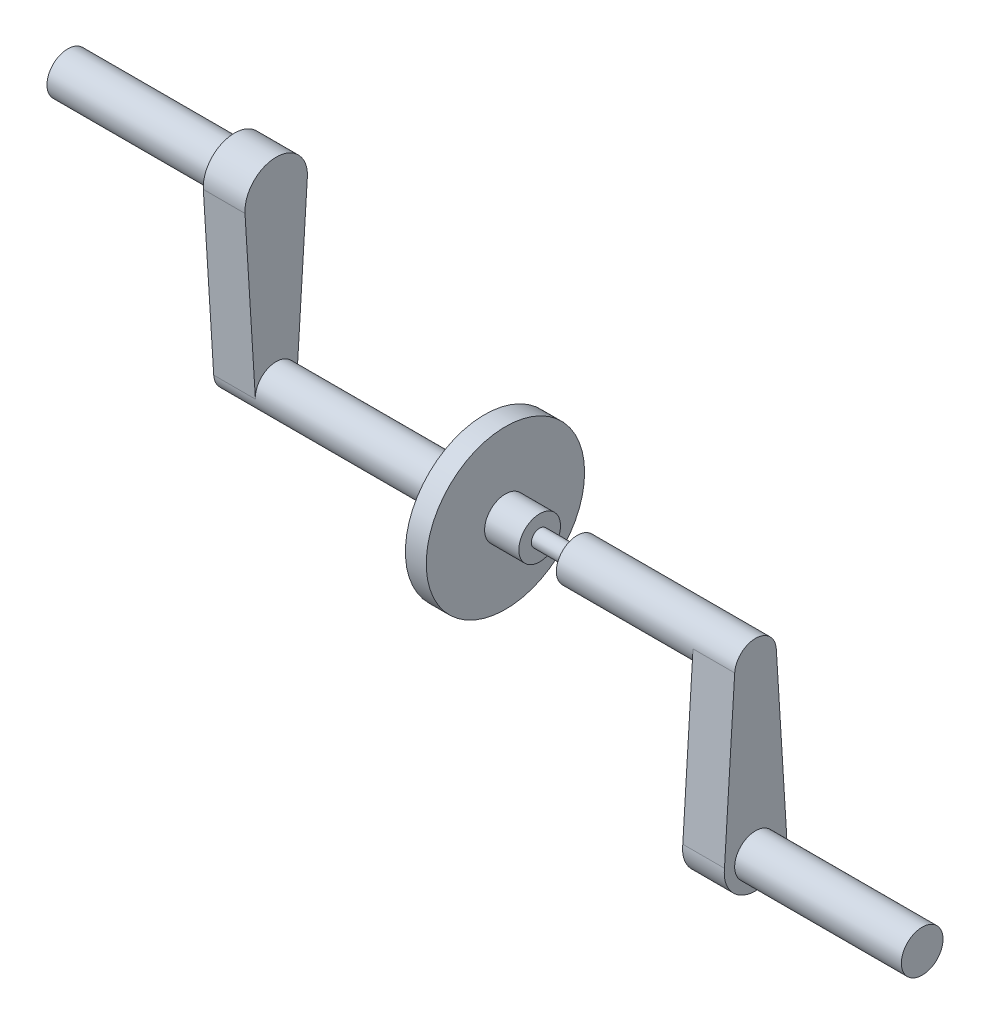
ISO-10303-21;
HEADER;
FILE_DESCRIPTION(('STEP AP214'),'2;1');
FILE_NAME('part.step','',(''),(''),'','','');
FILE_SCHEMA(('AUTOMOTIVE_DESIGN { 1 0 10303 214 1 1 1 1 }'));
ENDSEC;
DATA;
#1=APPLICATION_CONTEXT('core data for automotive mechanical design processes');
#2=APPLICATION_PROTOCOL_DEFINITION('international standard','automotive_design',2000,#1);
#3=PRODUCT_CONTEXT('',#1,'mechanical');
#4=PRODUCT('Part','Part','',(#3));
#5=PRODUCT_RELATED_PRODUCT_CATEGORY('part','',(#4));
#6=PRODUCT_DEFINITION_FORMATION('','',#4);
#7=PRODUCT_DEFINITION_CONTEXT('part definition',#1,'design');
#8=PRODUCT_DEFINITION('design','',#6,#7);
#9=PRODUCT_DEFINITION_SHAPE('','',#8);
#10=(LENGTH_UNIT() NAMED_UNIT(*) SI_UNIT(.MILLI.,.METRE.));
#11=(NAMED_UNIT(*) PLANE_ANGLE_UNIT() SI_UNIT($,.RADIAN.));
#12=(NAMED_UNIT(*) SI_UNIT($,.STERADIAN.) SOLID_ANGLE_UNIT());
#13=UNCERTAINTY_MEASURE_WITH_UNIT(LENGTH_MEASURE(1.E-05),#10,'distance_accuracy_value','');
#14=(GEOMETRIC_REPRESENTATION_CONTEXT(3) GLOBAL_UNCERTAINTY_ASSIGNED_CONTEXT((#13)) GLOBAL_UNIT_ASSIGNED_CONTEXT((#10,
#11,#12)) REPRESENTATION_CONTEXT('',''));
#15=CARTESIAN_POINT('',(0.,0.,0.));
#16=DIRECTION('',(0.,0.,1.));
#17=DIRECTION('',(1.,0.,0.));
#18=AXIS2_PLACEMENT_3D('',#15,#16,#17);
#19=CARTESIAN_POINT('',(105.,0.,0.));
#20=DIRECTION('',(-1.,0.,0.));
#21=DIRECTION('',(0.,0.,1.));
#22=AXIS2_PLACEMENT_3D('',#19,#20,#21);
#23=CYLINDRICAL_SURFACE('',#22,10.);
#24=CARTESIAN_POINT('',(5.,0.,0.));
#25=DIRECTION('',(1.,0.,0.));
#26=DIRECTION('',(0.,0.,-1.));
#27=AXIS2_PLACEMENT_3D('',#24,#25,#26);
#28=CIRCLE('',#27,10.);
#29=CARTESIAN_POINT('',(5.,0.,-10.));
#30=VERTEX_POINT('',#29);
#31=EDGE_CURVE('E11',#30,#30,#28,.T.);
#32=ORIENTED_EDGE('',*,*,#31,.T.);
#33=EDGE_LOOP('',(#32));
#34=FACE_BOUND('',#33,.T.);
#35=CARTESIAN_POINT('',(21.44,0.,0.));
#36=DIRECTION('',(1.,0.,0.));
#37=DIRECTION('',(0.,0.,-1.));
#38=AXIS2_PLACEMENT_3D('',#35,#36,#37);
#39=CIRCLE('',#38,10.);
#40=CARTESIAN_POINT('',(21.44,0.,-10.));
#41=VERTEX_POINT('',#40);
#42=EDGE_CURVE('E216',#41,#41,#39,.T.);
#43=ORIENTED_EDGE('',*,*,#42,.F.);
#44=EDGE_LOOP('',(#43));
#45=FACE_BOUND('',#44,.T.);
#46=ADVANCED_FACE('F40',(#34,#45),#23,.T.);
#47=CARTESIAN_POINT('',(5.,0.,0.));
#48=DIRECTION('',(-1.,0.,0.));
#49=DIRECTION('',(0.,0.,1.));
#50=AXIS2_PLACEMENT_3D('',#47,#48,#49);
#51=CYLINDRICAL_SURFACE('',#50,38.);
#52=CARTESIAN_POINT('',(5.,0.,0.));
#53=DIRECTION('',(1.,0.,0.));
#54=DIRECTION('',(0.,0.,-1.));
#55=AXIS2_PLACEMENT_3D('',#52,#53,#54);
#56=CIRCLE('',#55,38.);
#57=CARTESIAN_POINT('',(5.,0.,-38.));
#58=VERTEX_POINT('',#57);
#59=EDGE_CURVE('E49',#58,#58,#56,.T.);
#60=ORIENTED_EDGE('',*,*,#59,.F.);
#61=EDGE_LOOP('',(#60));
#62=FACE_BOUND('',#61,.T.);
#63=CARTESIAN_POINT('',(-5.,0.,0.));
#64=DIRECTION('',(1.,0.,0.));
#65=DIRECTION('',(0.,0.,-1.));
#66=AXIS2_PLACEMENT_3D('',#63,#64,#65);
#67=CIRCLE('',#66,38.);
#68=CARTESIAN_POINT('',(-5.,0.,-38.));
#69=VERTEX_POINT('',#68);
#70=EDGE_CURVE('E44',#69,#69,#67,.T.);
#71=ORIENTED_EDGE('',*,*,#70,.T.);
#72=EDGE_LOOP('',(#71));
#73=FACE_BOUND('',#72,.T.);
#74=ADVANCED_FACE('F42',(#62,#73),#51,.T.);
#75=CARTESIAN_POINT('',(5.,0.,0.));
#76=DIRECTION('',(1.,0.,0.));
#77=DIRECTION('',(0.,0.,-1.));
#78=AXIS2_PLACEMENT_3D('',#75,#76,#77);
#79=PLANE('',#78);
#80=ORIENTED_EDGE('',*,*,#31,.F.);
#81=EDGE_LOOP('',(#80));
#82=FACE_BOUND('',#81,.T.);
#83=ORIENTED_EDGE('',*,*,#59,.T.);
#84=EDGE_LOOP('',(#83));
#85=FACE_BOUND('',#84,.T.);
#86=ADVANCED_FACE('F180',(#82,#85),#79,.T.);
#87=CARTESIAN_POINT('',(-5.,0.,0.));
#88=DIRECTION('',(1.,0.,0.));
#89=DIRECTION('',(0.,0.,-1.));
#90=AXIS2_PLACEMENT_3D('',#87,#88,#89);
#91=PLANE('',#90);
#92=CARTESIAN_POINT('',(-5.,0.,0.));
#93=DIRECTION('',(1.,0.,0.));
#94=DIRECTION('',(0.,0.,-1.));
#95=AXIS2_PLACEMENT_3D('',#92,#93,#94);
#96=CIRCLE('',#95,10.);
#97=CARTESIAN_POINT('',(-5.,0.,-10.));
#98=VERTEX_POINT('',#97);
#99=EDGE_CURVE('E129',#98,#98,#96,.T.);
#100=ORIENTED_EDGE('',*,*,#99,.T.);
#101=EDGE_LOOP('',(#100));
#102=FACE_BOUND('',#101,.T.);
#103=ORIENTED_EDGE('',*,*,#70,.F.);
#104=EDGE_LOOP('',(#103));
#105=FACE_BOUND('',#104,.T.);
#106=ADVANCED_FACE('F178',(#102,#105),#91,.F.);
#107=CARTESIAN_POINT('',(-105.,0.,0.));
#108=DIRECTION('',(1.,0.,0.));
#109=DIRECTION('',(0.,0.,-1.));
#110=AXIS2_PLACEMENT_3D('',#107,#108,#109);
#111=CYLINDRICAL_SURFACE('',#110,10.);
#112=CARTESIAN_POINT('',(-105.,0.,0.));
#113=DIRECTION('',(1.,0.,0.));
#114=DIRECTION('',(0.,0.,-1.));
#115=AXIS2_PLACEMENT_3D('',#112,#113,#114);
#116=CIRCLE('',#115,10.);
#117=CARTESIAN_POINT('',(-105.,-0.621376726951341,-9.98067587707383));
#118=VERTEX_POINT('',#117);
#119=CARTESIAN_POINT('',(-105.,-0.624999999999999,9.98044963916957));
#120=VERTEX_POINT('',#119);
#121=EDGE_CURVE('E128',#118,#120,#116,.T.);
#122=ORIENTED_EDGE('',*,*,#121,.T.);
#123=DIRECTION('',(1.,0.,0.));
#124=VECTOR('',#123,1.);
#125=CARTESIAN_POINT('',(-125.,-0.625,9.98044963916957));
#126=LINE('',#125,#124);
#127=CARTESIAN_POINT('',(-125.,-0.625,9.98044963916957));
#128=VERTEX_POINT('',#127);
#129=EDGE_CURVE('E57',#128,#120,#126,.T.);
#130=ORIENTED_EDGE('',*,*,#129,.F.);
#131=CARTESIAN_POINT('',(-125.,0.,0.));
#132=DIRECTION('',(-1.,0.,0.));
#133=DIRECTION('',(0.,0.,1.));
#134=AXIS2_PLACEMENT_3D('',#131,#132,#133);
#135=CIRCLE('',#134,10.);
#136=CARTESIAN_POINT('',(-125.,-0.621376726951341,-9.98067587707383));
#137=VERTEX_POINT('',#136);
#138=EDGE_CURVE('E114',#137,#128,#135,.T.);
#139=ORIENTED_EDGE('',*,*,#138,.F.);
#140=DIRECTION('',(1.,0.,0.));
#141=VECTOR('',#140,1.);
#142=CARTESIAN_POINT('',(-125.,-0.621376726951341,-9.98067587707383));
#143=LINE('',#142,#141);
#144=EDGE_CURVE('E235',#137,#118,#143,.T.);
#145=ORIENTED_EDGE('',*,*,#144,.T.);
#146=EDGE_LOOP('',(#122,#130,#139,#145));
#147=FACE_BOUND('',#146,.T.);
#148=ORIENTED_EDGE('',*,*,#99,.F.);
#149=EDGE_LOOP('',(#148));
#150=FACE_BOUND('',#149,.T.);
#151=ADVANCED_FACE('F126',(#147,#150),#111,.T.);
#152=CARTESIAN_POINT('',(-125.,79.0625,14.9706744587543));
#153=DIRECTION('',(0.,0.0624999999999999,-0.998044963916957));
#154=DIRECTION('',(0.,0.998044963916957,0.0624999999999999));
#155=AXIS2_PLACEMENT_3D('',#152,#153,#154);
#156=PLANE('',#155);
#157=DIRECTION('',(0.,0.998044963916957,0.0624999999999999));
#158=VECTOR('',#157,1.);
#159=CARTESIAN_POINT('',(-105.,79.0625,14.9706744587543));
#160=LINE('',#159,#158);
#161=CARTESIAN_POINT('',(-105.,79.0625,14.9706744587544));
#162=VERTEX_POINT('',#161);
#163=EDGE_CURVE('E230',#120,#162,#160,.T.);
#164=ORIENTED_EDGE('',*,*,#163,.T.);
#165=DIRECTION('',(1.,0.,0.));
#166=VECTOR('',#165,1.);
#167=CARTESIAN_POINT('',(-125.,79.0625,14.9706744587544));
#168=LINE('',#167,#166);
#169=CARTESIAN_POINT('',(-125.,79.0625,14.9706744587544));
#170=VERTEX_POINT('',#169);
#171=EDGE_CURVE('E110',#170,#162,#168,.T.);
#172=ORIENTED_EDGE('',*,*,#171,.F.);
#173=DIRECTION('',(0.,0.998044963916957,0.0624999999999999));
#174=VECTOR('',#173,1.);
#175=CARTESIAN_POINT('',(-125.,79.0625,14.9706744587543));
#176=LINE('',#175,#174);
#177=EDGE_CURVE('E106',#128,#170,#176,.T.);
#178=ORIENTED_EDGE('',*,*,#177,.F.);
#179=ORIENTED_EDGE('',*,*,#129,.T.);
#180=EDGE_LOOP('',(#164,#172,#178,#179));
#181=FACE_BOUND('',#180,.T.);
#182=ADVANCED_FACE('F108',(#181),#156,.F.);
#183=CARTESIAN_POINT('',(-125.,80.,0.));
#184=DIRECTION('',(1.,0.,0.));
#185=DIRECTION('',(0.,0.,-1.));
#186=AXIS2_PLACEMENT_3D('',#183,#184,#185);
#187=CYLINDRICAL_SURFACE('',#186,15.);
#188=CARTESIAN_POINT('',(-105.,80.,0.));
#189=DIRECTION('',(-1.,0.,0.));
#190=DIRECTION('',(0.,0.,1.));
#191=AXIS2_PLACEMENT_3D('',#188,#189,#190);
#192=CIRCLE('',#191,15.);
#193=CARTESIAN_POINT('',(-105.,78.1394720872225,-14.884167288961));
#194=VERTEX_POINT('',#193);
#195=EDGE_CURVE('E237',#162,#194,#192,.T.);
#196=ORIENTED_EDGE('',*,*,#195,.T.);
#197=DIRECTION('',(1.,0.,0.));
#198=VECTOR('',#197,1.);
#199=CARTESIAN_POINT('',(-125.,78.1394720872225,-14.884167288961));
#200=LINE('',#199,#198);
#201=CARTESIAN_POINT('',(-125.,78.1394720872225,-14.884167288961));
#202=VERTEX_POINT('',#201);
#203=EDGE_CURVE('E133',#202,#194,#200,.T.);
#204=ORIENTED_EDGE('',*,*,#203,.F.);
#205=CARTESIAN_POINT('',(-125.,80.,0.));
#206=DIRECTION('',(-1.,0.,0.));
#207=DIRECTION('',(0.,0.,1.));
#208=AXIS2_PLACEMENT_3D('',#205,#206,#207);
#209=CIRCLE('',#208,15.);
#210=EDGE_CURVE('E113',#170,#202,#209,.T.);
#211=ORIENTED_EDGE('',*,*,#210,.F.);
#212=ORIENTED_EDGE('',*,*,#171,.T.);
#213=EDGE_LOOP('',(#196,#204,#211,#212));
#214=FACE_BOUND('',#213,.T.);
#215=ADVANCED_FACE('F250',(#214),#187,.T.);
#216=CARTESIAN_POINT('',(-125.,78.1394720872225,-14.884167288961));
#217=DIRECTION('',(0.,0.062137672695134,0.998067587707382));
#218=DIRECTION('',(0.,-0.998067587707382,0.062137672695134));
#219=AXIS2_PLACEMENT_3D('',#216,#217,#218);
#220=PLANE('',#219);
#221=DIRECTION('',(0.,-0.998067587707382,0.062137672695134));
#222=VECTOR('',#221,1.);
#223=CARTESIAN_POINT('',(-105.,78.1394720872225,-14.884167288961));
#224=LINE('',#223,#222);
#225=EDGE_CURVE('E123',#194,#118,#224,.T.);
#226=ORIENTED_EDGE('',*,*,#225,.T.);
#227=ORIENTED_EDGE('',*,*,#144,.F.);
#228=DIRECTION('',(0.,-0.998067587707382,0.062137672695134));
#229=VECTOR('',#228,1.);
#230=CARTESIAN_POINT('',(-125.,78.1394720872225,-14.884167288961));
#231=LINE('',#230,#229);
#232=EDGE_CURVE('E119',#202,#137,#231,.T.);
#233=ORIENTED_EDGE('',*,*,#232,.F.);
#234=ORIENTED_EDGE('',*,*,#203,.T.);
#235=EDGE_LOOP('',(#226,#227,#233,#234));
#236=FACE_BOUND('',#235,.T.);
#237=ADVANCED_FACE('F245',(#236),#220,.F.);
#238=CARTESIAN_POINT('',(-125.,0.,0.));
#239=DIRECTION('',(-1.,0.,0.));
#240=DIRECTION('',(0.,0.,1.));
#241=AXIS2_PLACEMENT_3D('',#238,#239,#240);
#242=PLANE('',#241);
#243=CARTESIAN_POINT('',(-125.,80.,0.));
#244=DIRECTION('',(-1.,0.,0.));
#245=DIRECTION('',(0.,0.,1.));
#246=AXIS2_PLACEMENT_3D('',#243,#244,#245);
#247=CIRCLE('',#246,10.);
#248=CARTESIAN_POINT('',(-125.,80.,10.));
#249=VERTEX_POINT('',#248);
#250=EDGE_CURVE('E220',#249,#249,#247,.T.);
#251=ORIENTED_EDGE('',*,*,#250,.F.);
#252=EDGE_LOOP('',(#251));
#253=FACE_BOUND('',#252,.T.);
#254=ORIENTED_EDGE('',*,*,#138,.T.);
#255=ORIENTED_EDGE('',*,*,#177,.T.);
#256=ORIENTED_EDGE('',*,*,#210,.T.);
#257=ORIENTED_EDGE('',*,*,#232,.T.);
#258=EDGE_LOOP('',(#254,#255,#256,#257));
#259=FACE_BOUND('',#258,.T.);
#260=ADVANCED_FACE('F117',(#253,#259),#242,.T.);
#261=CARTESIAN_POINT('',(-105.,0.,0.));
#262=DIRECTION('',(-1.,0.,0.));
#263=DIRECTION('',(0.,0.,1.));
#264=AXIS2_PLACEMENT_3D('',#261,#262,#263);
#265=PLANE('',#264);
#266=ORIENTED_EDGE('',*,*,#121,.F.);
#267=ORIENTED_EDGE('',*,*,#225,.F.);
#268=ORIENTED_EDGE('',*,*,#195,.F.);
#269=ORIENTED_EDGE('',*,*,#163,.F.);
#270=EDGE_LOOP('',(#266,#267,#268,#269));
#271=FACE_BOUND('',#270,.T.);
#272=ADVANCED_FACE('F249',(#271),#265,.F.);
#273=CARTESIAN_POINT('',(-205.,80.,0.));
#274=DIRECTION('',(1.,0.,0.));
#275=DIRECTION('',(0.,0.,-1.));
#276=AXIS2_PLACEMENT_3D('',#273,#274,#275);
#277=CYLINDRICAL_SURFACE('',#276,10.);
#278=CARTESIAN_POINT('',(-205.,80.,0.));
#279=DIRECTION('',(-1.,0.,0.));
#280=DIRECTION('',(0.,0.,1.));
#281=AXIS2_PLACEMENT_3D('',#278,#279,#280);
#282=CIRCLE('',#281,10.);
#283=CARTESIAN_POINT('',(-205.,80.,10.));
#284=VERTEX_POINT('',#283);
#285=EDGE_CURVE('E227',#284,#284,#282,.T.);
#286=ORIENTED_EDGE('',*,*,#285,.F.);
#287=EDGE_LOOP('',(#286));
#288=FACE_BOUND('',#287,.T.);
#289=ORIENTED_EDGE('',*,*,#250,.T.);
#290=EDGE_LOOP('',(#289));
#291=FACE_BOUND('',#290,.T.);
#292=ADVANCED_FACE('F365',(#288,#291),#277,.T.);
#293=CARTESIAN_POINT('',(-205.,80.,0.));
#294=DIRECTION('',(-1.,0.,0.));
#295=DIRECTION('',(0.,0.,1.));
#296=AXIS2_PLACEMENT_3D('',#293,#294,#295);
#297=PLANE('',#296);
#298=ORIENTED_EDGE('',*,*,#285,.T.);
#299=EDGE_LOOP('',(#298));
#300=FACE_BOUND('',#299,.T.);
#301=ADVANCED_FACE('F372',(#300),#297,.T.);
#302=CARTESIAN_POINT('',(21.44,0.,0.));
#303=DIRECTION('',(1.,0.,0.));
#304=DIRECTION('',(0.,0.,-1.));
#305=AXIS2_PLACEMENT_3D('',#302,#303,#304);
#306=PLANE('',#305);
#307=CARTESIAN_POINT('',(21.44,0.,0.));
#308=DIRECTION('',(1.,0.,0.));
#309=DIRECTION('',(0.,0.,-1.));
#310=AXIS2_PLACEMENT_3D('',#307,#308,#309);
#311=CIRCLE('',#310,4.);
#312=CARTESIAN_POINT('',(21.44,0.,-4.));
#313=VERTEX_POINT('',#312);
#314=EDGE_CURVE('E217',#313,#313,#311,.T.);
#315=ORIENTED_EDGE('',*,*,#314,.F.);
#316=EDGE_LOOP('',(#315));
#317=FACE_BOUND('',#316,.T.);
#318=ORIENTED_EDGE('',*,*,#42,.T.);
#319=EDGE_LOOP('',(#318));
#320=FACE_BOUND('',#319,.T.);
#321=ADVANCED_FACE('F381',(#317,#320),#306,.T.);
#322=CARTESIAN_POINT('',(39.44,0.,0.));
#323=DIRECTION('',(1.,0.,0.));
#324=DIRECTION('',(0.,0.,-1.));
#325=AXIS2_PLACEMENT_3D('',#322,#323,#324);
#326=PLANE('',#325);
#327=CARTESIAN_POINT('',(39.44,0.,0.));
#328=DIRECTION('',(1.,0.,0.));
#329=DIRECTION('',(0.,0.,-1.));
#330=AXIS2_PLACEMENT_3D('',#327,#328,#329);
#331=CIRCLE('',#330,4.);
#332=CARTESIAN_POINT('',(39.44,0.,-4.));
#333=VERTEX_POINT('',#332);
#334=EDGE_CURVE('E223',#333,#333,#331,.T.);
#335=ORIENTED_EDGE('',*,*,#334,.T.);
#336=EDGE_LOOP('',(#335));
#337=FACE_BOUND('',#336,.T.);
#338=CARTESIAN_POINT('',(39.44,0.,0.));
#339=DIRECTION('',(1.,0.,0.));
#340=DIRECTION('',(0.,0.,-1.));
#341=AXIS2_PLACEMENT_3D('',#338,#339,#340);
#342=CIRCLE('',#341,10.);
#343=CARTESIAN_POINT('',(39.44,0.,-10.));
#344=VERTEX_POINT('',#343);
#345=EDGE_CURVE('E214',#344,#344,#342,.T.);
#346=ORIENTED_EDGE('',*,*,#345,.F.);
#347=EDGE_LOOP('',(#346));
#348=FACE_BOUND('',#347,.T.);
#349=ADVANCED_FACE('F397',(#337,#348),#326,.F.);
#350=CARTESIAN_POINT('',(21.44,0.,0.));
#351=DIRECTION('',(1.,0.,0.));
#352=DIRECTION('',(0.,0.,-1.));
#353=AXIS2_PLACEMENT_3D('',#350,#351,#352);
#354=CYLINDRICAL_SURFACE('',#353,4.);
#355=ORIENTED_EDGE('',*,*,#314,.T.);
#356=EDGE_LOOP('',(#355));
#357=FACE_BOUND('',#356,.T.);
#358=ORIENTED_EDGE('',*,*,#334,.F.);
#359=EDGE_LOOP('',(#358));
#360=FACE_BOUND('',#359,.T.);
#361=ADVANCED_FACE('F264',(#357,#360),#354,.T.);
#362=CARTESIAN_POINT('',(205.,-80.,0.));
#363=DIRECTION('',(1.,0.,0.));
#364=DIRECTION('',(0.,0.,-1.));
#365=AXIS2_PLACEMENT_3D('',#362,#363,#364);
#366=PLANE('',#365);
#367=CARTESIAN_POINT('',(205.,-80.,0.));
#368=DIRECTION('',(1.,0.,0.));
#369=DIRECTION('',(0.,0.,-1.));
#370=AXIS2_PLACEMENT_3D('',#367,#368,#369);
#371=CIRCLE('',#370,10.);
#372=CARTESIAN_POINT('',(205.,-80.,-10.));
#373=VERTEX_POINT('',#372);
#374=EDGE_CURVE('E139',#373,#373,#371,.T.);
#375=ORIENTED_EDGE('',*,*,#374,.T.);
#376=EDGE_LOOP('',(#375));
#377=FACE_BOUND('',#376,.T.);
#378=ADVANCED_FACE('F261',(#377),#366,.T.);
#379=CARTESIAN_POINT('',(205.,-80.,0.));
#380=DIRECTION('',(-1.,0.,0.));
#381=DIRECTION('',(0.,0.,1.));
#382=AXIS2_PLACEMENT_3D('',#379,#380,#381);
#383=CYLINDRICAL_SURFACE('',#382,10.);
#384=ORIENTED_EDGE('',*,*,#374,.F.);
#385=EDGE_LOOP('',(#384));
#386=FACE_BOUND('',#385,.T.);
#387=CARTESIAN_POINT('',(125.,-80.,0.));
#388=DIRECTION('',(1.,0.,0.));
#389=DIRECTION('',(0.,0.,-1.));
#390=AXIS2_PLACEMENT_3D('',#387,#388,#389);
#391=CIRCLE('',#390,10.);
#392=CARTESIAN_POINT('',(125.,-80.,-10.));
#393=VERTEX_POINT('',#392);
#394=EDGE_CURVE('E137',#393,#393,#391,.T.);
#395=ORIENTED_EDGE('',*,*,#394,.T.);
#396=EDGE_LOOP('',(#395));
#397=FACE_BOUND('',#396,.T.);
#398=ADVANCED_FACE('F263',(#386,#397),#383,.T.);
#399=CARTESIAN_POINT('',(125.,-80.,0.));
#400=DIRECTION('',(-1.,0.,0.));
#401=DIRECTION('',(0.,0.,1.));
#402=AXIS2_PLACEMENT_3D('',#399,#400,#401);
#403=CYLINDRICAL_SURFACE('',#402,15.);
#404=CARTESIAN_POINT('',(105.,-80.,0.));
#405=DIRECTION('',(1.,0.,0.));
#406=DIRECTION('',(0.,0.,-1.));
#407=AXIS2_PLACEMENT_3D('',#404,#405,#406);
#408=CIRCLE('',#407,15.);
#409=CARTESIAN_POINT('',(105.,-78.1394720872225,14.884167288961));
#410=VERTEX_POINT('',#409);
#411=CARTESIAN_POINT('',(105.,-78.1394720872225,-14.884167288961));
#412=VERTEX_POINT('',#411);
#413=EDGE_CURVE('E157',#410,#412,#408,.T.);
#414=ORIENTED_EDGE('',*,*,#413,.T.);
#415=DIRECTION('',(-1.,0.,0.));
#416=VECTOR('',#415,1.);
#417=CARTESIAN_POINT('',(125.,-78.1394720872225,-14.884167288961));
#418=LINE('',#417,#416);
#419=CARTESIAN_POINT('',(125.,-78.1394720872225,-14.884167288961));
#420=VERTEX_POINT('',#419);
#421=EDGE_CURVE('E162',#420,#412,#418,.T.);
#422=ORIENTED_EDGE('',*,*,#421,.F.);
#423=CARTESIAN_POINT('',(125.,-80.,0.));
#424=DIRECTION('',(1.,0.,0.));
#425=DIRECTION('',(0.,0.,-1.));
#426=AXIS2_PLACEMENT_3D('',#423,#424,#425);
#427=CIRCLE('',#426,15.);
#428=CARTESIAN_POINT('',(125.,-78.1394720872225,14.884167288961));
#429=VERTEX_POINT('',#428);
#430=EDGE_CURVE('E151',#429,#420,#427,.T.);
#431=ORIENTED_EDGE('',*,*,#430,.F.);
#432=DIRECTION('',(-1.,0.,0.));
#433=VECTOR('',#432,1.);
#434=CARTESIAN_POINT('',(125.,-78.1394720872225,14.884167288961));
#435=LINE('',#434,#433);
#436=EDGE_CURVE('E165',#429,#410,#435,.T.);
#437=ORIENTED_EDGE('',*,*,#436,.T.);
#438=EDGE_LOOP('',(#414,#422,#431,#437));
#439=FACE_BOUND('',#438,.T.);
#440=ADVANCED_FACE('F268',(#439),#403,.T.);
#441=CARTESIAN_POINT('',(125.,0.621376726951341,-9.98067587707382));
#442=DIRECTION('',(0.,-0.062137672695134,0.998067587707382));
#443=DIRECTION('',(0.,-0.998067587707382,-0.062137672695134));
#444=AXIS2_PLACEMENT_3D('',#441,#442,#443);
#445=PLANE('',#444);
#446=DIRECTION('',(0.,0.998067587707382,0.062137672695134));
#447=VECTOR('',#446,1.);
#448=CARTESIAN_POINT('',(105.,0.621376726951341,-9.98067587707382));
#449=LINE('',#448,#447);
#450=CARTESIAN_POINT('',(105.,0.621376726951341,-9.98067587707382));
#451=VERTEX_POINT('',#450);
#452=EDGE_CURVE('E149',#412,#451,#449,.T.);
#453=ORIENTED_EDGE('',*,*,#452,.T.);
#454=DIRECTION('',(-1.,0.,0.));
#455=VECTOR('',#454,1.);
#456=CARTESIAN_POINT('',(125.,0.621376726951341,-9.98067587707382));
#457=LINE('',#456,#455);
#458=CARTESIAN_POINT('',(125.,0.621376726951341,-9.98067587707382));
#459=VERTEX_POINT('',#458);
#460=EDGE_CURVE('E155',#459,#451,#457,.T.);
#461=ORIENTED_EDGE('',*,*,#460,.F.);
#462=DIRECTION('',(0.,0.998067587707382,0.062137672695134));
#463=VECTOR('',#462,1.);
#464=CARTESIAN_POINT('',(125.,0.621376726951341,-9.98067587707382));
#465=LINE('',#464,#463);
#466=EDGE_CURVE('E153',#420,#459,#465,.T.);
#467=ORIENTED_EDGE('',*,*,#466,.F.);
#468=ORIENTED_EDGE('',*,*,#421,.T.);
#469=EDGE_LOOP('',(#453,#461,#467,#468));
#470=FACE_BOUND('',#469,.T.);
#471=ADVANCED_FACE('F272',(#470),#445,.F.);
#472=CARTESIAN_POINT('',(125.,0.,0.));
#473=DIRECTION('',(1.,0.,0.));
#474=DIRECTION('',(0.,0.,-1.));
#475=AXIS2_PLACEMENT_3D('',#472,#473,#474);
#476=PLANE('',#475);
#477=ORIENTED_EDGE('',*,*,#394,.F.);
#478=EDGE_LOOP('',(#477));
#479=FACE_BOUND('',#478,.T.);
#480=CARTESIAN_POINT('',(125.,0.,0.));
#481=DIRECTION('',(1.,0.,0.));
#482=DIRECTION('',(0.,0.,-1.));
#483=AXIS2_PLACEMENT_3D('',#480,#481,#482);
#484=CIRCLE('',#483,10.);
#485=CARTESIAN_POINT('',(125.,0.621376726951341,9.98067587707382));
#486=VERTEX_POINT('',#485);
#487=EDGE_CURVE('E145',#459,#486,#484,.T.);
#488=ORIENTED_EDGE('',*,*,#487,.T.);
#489=DIRECTION('',(0.,-0.998067587707382,0.062137672695134));
#490=VECTOR('',#489,1.);
#491=CARTESIAN_POINT('',(125.,0.621376726951341,9.98067587707382));
#492=LINE('',#491,#490);
#493=EDGE_CURVE('E148',#486,#429,#492,.T.);
#494=ORIENTED_EDGE('',*,*,#493,.T.);
#495=ORIENTED_EDGE('',*,*,#430,.T.);
#496=ORIENTED_EDGE('',*,*,#466,.T.);
#497=EDGE_LOOP('',(#488,#494,#495,#496));
#498=FACE_BOUND('',#497,.T.);
#499=ADVANCED_FACE('F270',(#479,#498),#476,.T.);
#500=CARTESIAN_POINT('',(125.,0.621376726951341,9.98067587707382));
#501=DIRECTION('',(0.,-0.062137672695134,-0.998067587707382));
#502=DIRECTION('',(0.,0.998067587707382,-0.062137672695134));
#503=AXIS2_PLACEMENT_3D('',#500,#501,#502);
#504=PLANE('',#503);
#505=DIRECTION('',(0.,-0.998067587707382,0.062137672695134));
#506=VECTOR('',#505,1.);
#507=CARTESIAN_POINT('',(105.,0.621376726951341,9.98067587707382));
#508=LINE('',#507,#506);
#509=CARTESIAN_POINT('',(105.,0.62137672695134,9.98067587707382));
#510=VERTEX_POINT('',#509);
#511=EDGE_CURVE('E142',#510,#410,#508,.T.);
#512=ORIENTED_EDGE('',*,*,#511,.T.);
#513=ORIENTED_EDGE('',*,*,#436,.F.);
#514=ORIENTED_EDGE('',*,*,#493,.F.);
#515=DIRECTION('',(-1.,0.,0.));
#516=VECTOR('',#515,1.);
#517=CARTESIAN_POINT('',(125.,0.621376726951341,9.98067587707382));
#518=LINE('',#517,#516);
#519=EDGE_CURVE('E168',#486,#510,#518,.T.);
#520=ORIENTED_EDGE('',*,*,#519,.T.);
#521=EDGE_LOOP('',(#512,#513,#514,#520));
#522=FACE_BOUND('',#521,.T.);
#523=ADVANCED_FACE('F209',(#522),#504,.F.);
#524=CARTESIAN_POINT('',(105.,0.,0.));
#525=DIRECTION('',(1.,0.,0.));
#526=DIRECTION('',(0.,0.,-1.));
#527=AXIS2_PLACEMENT_3D('',#524,#525,#526);
#528=PLANE('',#527);
#529=ORIENTED_EDGE('',*,*,#511,.F.);
#530=CARTESIAN_POINT('',(105.,0.,0.));
#531=DIRECTION('',(1.,0.,0.));
#532=DIRECTION('',(0.,0.,-1.));
#533=AXIS2_PLACEMENT_3D('',#530,#531,#532);
#534=CIRCLE('',#533,10.);
#535=EDGE_CURVE('E65',#510,#451,#534,.T.);
#536=ORIENTED_EDGE('',*,*,#535,.T.);
#537=ORIENTED_EDGE('',*,*,#452,.F.);
#538=ORIENTED_EDGE('',*,*,#413,.F.);
#539=EDGE_LOOP('',(#529,#536,#537,#538));
#540=FACE_BOUND('',#539,.T.);
#541=ADVANCED_FACE('F203',(#540),#528,.F.);
#542=ORIENTED_EDGE('',*,*,#345,.T.);
#543=EDGE_LOOP('',(#542));
#544=FACE_BOUND('',#543,.T.);
#545=ORIENTED_EDGE('',*,*,#535,.F.);
#546=ORIENTED_EDGE('',*,*,#519,.F.);
#547=ORIENTED_EDGE('',*,*,#487,.F.);
#548=ORIENTED_EDGE('',*,*,#460,.T.);
#549=EDGE_LOOP('',(#545,#546,#547,#548));
#550=FACE_BOUND('',#549,.T.);
#551=ADVANCED_FACE('F193',(#544,#550),#23,.T.);
#552=CLOSED_SHELL('',(#46,#74,#86,#106,#151,#182,#215,#237,#260,#272,#292,#301,#321,#349,#361,
#378,#398,#440,#471,#499,#523,#541,#551));
#553=MANIFOLD_SOLID_BREP('B2',#552);
#554=ADVANCED_BREP_SHAPE_REPRESENTATION('',(#18,#553),#14);
#555=SHAPE_DEFINITION_REPRESENTATION(#9,#554);
ENDSEC;
END-ISO-10303-21;
